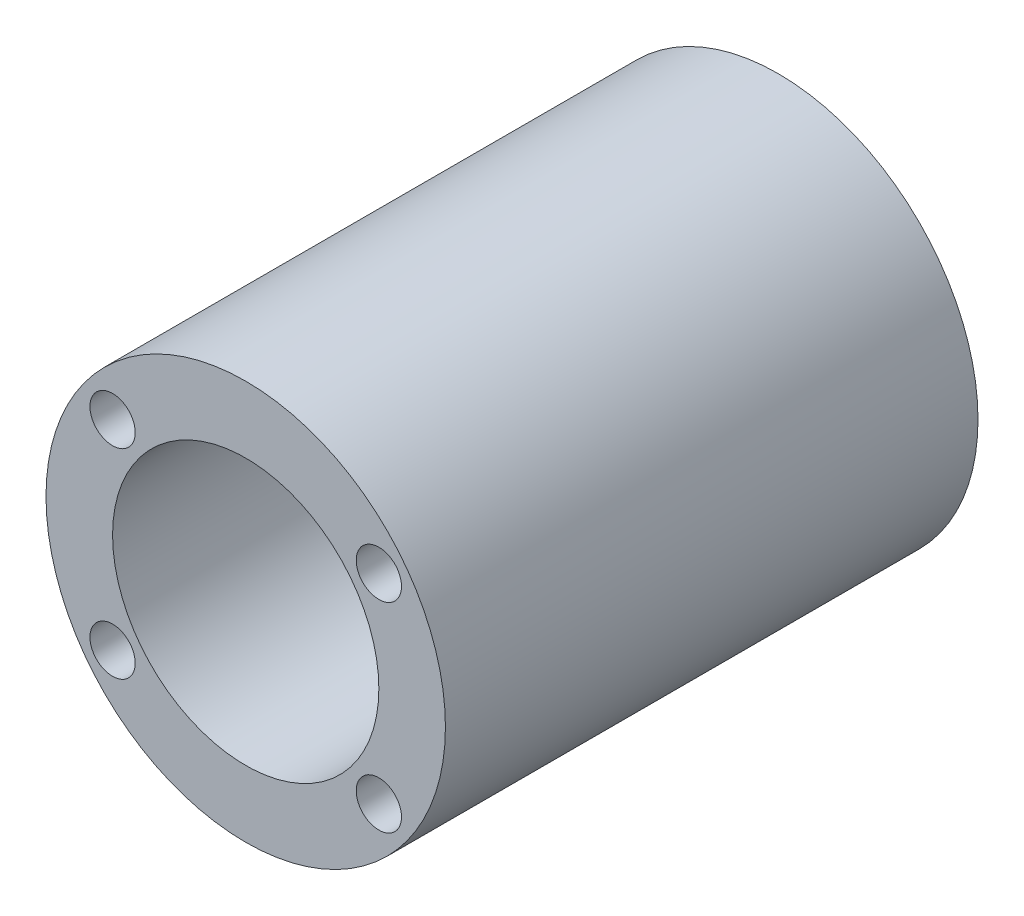
ISO-10303-21;
HEADER;
FILE_DESCRIPTION(('STEP AP214'),'2;1');
FILE_NAME('part.step','',(''),(''),'','','');
FILE_SCHEMA(('AUTOMOTIVE_DESIGN { 1 0 10303 214 1 1 1 1 }'));
ENDSEC;
DATA;
#1=APPLICATION_CONTEXT('core data for automotive mechanical design processes');
#2=APPLICATION_PROTOCOL_DEFINITION('international standard','automotive_design',2000,#1);
#3=PRODUCT_CONTEXT('',#1,'mechanical');
#4=PRODUCT('Part','Part','',(#3));
#5=PRODUCT_RELATED_PRODUCT_CATEGORY('part','',(#4));
#6=PRODUCT_DEFINITION_FORMATION('','',#4);
#7=PRODUCT_DEFINITION_CONTEXT('part definition',#1,'design');
#8=PRODUCT_DEFINITION('design','',#6,#7);
#9=PRODUCT_DEFINITION_SHAPE('','',#8);
#10=(LENGTH_UNIT() NAMED_UNIT(*) SI_UNIT(.MILLI.,.METRE.));
#11=(NAMED_UNIT(*) PLANE_ANGLE_UNIT() SI_UNIT($,.RADIAN.));
#12=(NAMED_UNIT(*) SI_UNIT($,.STERADIAN.) SOLID_ANGLE_UNIT());
#13=UNCERTAINTY_MEASURE_WITH_UNIT(LENGTH_MEASURE(1.E-05),#10,'distance_accuracy_value','');
#14=(GEOMETRIC_REPRESENTATION_CONTEXT(3) GLOBAL_UNCERTAINTY_ASSIGNED_CONTEXT((#13)) GLOBAL_UNIT_ASSIGNED_CONTEXT((#10,
#11,#12)) REPRESENTATION_CONTEXT('',''));
#15=CARTESIAN_POINT('',(0.,0.,0.));
#16=DIRECTION('',(0.,0.,1.));
#17=DIRECTION('',(1.,0.,0.));
#18=AXIS2_PLACEMENT_3D('',#15,#16,#17);
#19=CARTESIAN_POINT('',(0.,0.,40.));
#20=DIRECTION('',(0.,0.,1.));
#21=DIRECTION('',(1.,0.,0.));
#22=AXIS2_PLACEMENT_3D('',#19,#20,#21);
#23=PLANE('',#22);
#24=CARTESIAN_POINT('',(-20.,15.,40.));
#25=DIRECTION('',(0.,0.,1.));
#26=DIRECTION('',(1.,0.,0.));
#27=AXIS2_PLACEMENT_3D('',#24,#25,#26);
#28=CIRCLE('',#27,3.4);
#29=CARTESIAN_POINT('',(-16.6,15.,40.));
#30=VERTEX_POINT('',#29);
#31=EDGE_CURVE('E114',#30,#30,#28,.T.);
#32=ORIENTED_EDGE('',*,*,#31,.F.);
#33=EDGE_LOOP('',(#32));
#34=FACE_BOUND('',#33,.T.);
#35=CARTESIAN_POINT('',(20.,15.,40.));
#36=DIRECTION('',(0.,0.,1.));
#37=DIRECTION('',(1.,0.,0.));
#38=AXIS2_PLACEMENT_3D('',#35,#36,#37);
#39=CIRCLE('',#38,3.4);
#40=CARTESIAN_POINT('',(23.4,15.,40.));
#41=VERTEX_POINT('',#40);
#42=EDGE_CURVE('E122',#41,#41,#39,.T.);
#43=ORIENTED_EDGE('',*,*,#42,.F.);
#44=EDGE_LOOP('',(#43));
#45=FACE_BOUND('',#44,.T.);
#46=CARTESIAN_POINT('',(20.,-15.,40.));
#47=DIRECTION('',(0.,0.,1.));
#48=DIRECTION('',(1.,0.,0.));
#49=AXIS2_PLACEMENT_3D('',#46,#47,#48);
#50=CIRCLE('',#49,3.4);
#51=CARTESIAN_POINT('',(23.4,-15.,40.));
#52=VERTEX_POINT('',#51);
#53=EDGE_CURVE('E130',#52,#52,#50,.T.);
#54=ORIENTED_EDGE('',*,*,#53,.F.);
#55=EDGE_LOOP('',(#54));
#56=FACE_BOUND('',#55,.T.);
#57=CARTESIAN_POINT('',(-20.,-15.,40.));
#58=DIRECTION('',(0.,0.,1.));
#59=DIRECTION('',(1.,0.,0.));
#60=AXIS2_PLACEMENT_3D('',#57,#58,#59);
#61=CIRCLE('',#60,3.4);
#62=CARTESIAN_POINT('',(-16.6,-15.,40.));
#63=VERTEX_POINT('',#62);
#64=EDGE_CURVE('E138',#63,#63,#61,.T.);
#65=ORIENTED_EDGE('',*,*,#64,.F.);
#66=EDGE_LOOP('',(#65));
#67=FACE_BOUND('',#66,.T.);
#68=CARTESIAN_POINT('',(0.,0.,40.));
#69=DIRECTION('',(0.,0.,1.));
#70=DIRECTION('',(1.,0.,0.));
#71=AXIS2_PLACEMENT_3D('',#68,#69,#70);
#72=CIRCLE('',#71,30.);
#73=CARTESIAN_POINT('',(30.,0.,40.));
#74=VERTEX_POINT('',#73);
#75=EDGE_CURVE('E11',#74,#74,#72,.T.);
#76=ORIENTED_EDGE('',*,*,#75,.T.);
#77=EDGE_LOOP('',(#76));
#78=FACE_BOUND('',#77,.T.);
#79=CARTESIAN_POINT('',(0.,0.,40.));
#80=DIRECTION('',(0.,0.,1.));
#81=DIRECTION('',(1.,0.,0.));
#82=AXIS2_PLACEMENT_3D('',#79,#80,#81);
#83=CIRCLE('',#82,20.);
#84=CARTESIAN_POINT('',(20.,0.,40.));
#85=VERTEX_POINT('',#84);
#86=EDGE_CURVE('E147',#85,#85,#83,.T.);
#87=ORIENTED_EDGE('',*,*,#86,.F.);
#88=EDGE_LOOP('',(#87));
#89=FACE_BOUND('',#88,.T.);
#90=ADVANCED_FACE('F39',(#34,#45,#56,#67,#78,#89),#23,.T.);
#91=CARTESIAN_POINT('',(0.,0.,-40.));
#92=DIRECTION('',(0.,0.,1.));
#93=DIRECTION('',(1.,0.,0.));
#94=AXIS2_PLACEMENT_3D('',#91,#92,#93);
#95=PLANE('',#94);
#96=CARTESIAN_POINT('',(-20.,15.,-40.));
#97=DIRECTION('',(0.,0.,-1.));
#98=DIRECTION('',(-1.,0.,0.));
#99=AXIS2_PLACEMENT_3D('',#96,#97,#98);
#100=CIRCLE('',#99,3.4);
#101=CARTESIAN_POINT('',(-23.4,15.,-40.));
#102=VERTEX_POINT('',#101);
#103=EDGE_CURVE('E85',#102,#102,#100,.T.);
#104=ORIENTED_EDGE('',*,*,#103,.F.);
#105=EDGE_LOOP('',(#104));
#106=FACE_BOUND('',#105,.T.);
#107=CARTESIAN_POINT('',(20.,15.,-40.));
#108=DIRECTION('',(0.,0.,-1.));
#109=DIRECTION('',(-1.,0.,0.));
#110=AXIS2_PLACEMENT_3D('',#107,#108,#109);
#111=CIRCLE('',#110,3.4);
#112=CARTESIAN_POINT('',(16.6,15.,-40.));
#113=VERTEX_POINT('',#112);
#114=EDGE_CURVE('E84',#113,#113,#111,.T.);
#115=ORIENTED_EDGE('',*,*,#114,.F.);
#116=EDGE_LOOP('',(#115));
#117=FACE_BOUND('',#116,.T.);
#118=CARTESIAN_POINT('',(20.,-15.,-40.));
#119=DIRECTION('',(0.,0.,-1.));
#120=DIRECTION('',(-1.,0.,0.));
#121=AXIS2_PLACEMENT_3D('',#118,#119,#120);
#122=CIRCLE('',#121,3.4);
#123=CARTESIAN_POINT('',(16.6,-15.,-40.));
#124=VERTEX_POINT('',#123);
#125=EDGE_CURVE('E98',#124,#124,#122,.T.);
#126=ORIENTED_EDGE('',*,*,#125,.F.);
#127=EDGE_LOOP('',(#126));
#128=FACE_BOUND('',#127,.T.);
#129=CARTESIAN_POINT('',(-20.,-15.,-40.));
#130=DIRECTION('',(0.,0.,-1.));
#131=DIRECTION('',(-1.,0.,0.));
#132=AXIS2_PLACEMENT_3D('',#129,#130,#131);
#133=CIRCLE('',#132,3.4);
#134=CARTESIAN_POINT('',(-23.4,-15.,-40.));
#135=VERTEX_POINT('',#134);
#136=EDGE_CURVE('E106',#135,#135,#133,.T.);
#137=ORIENTED_EDGE('',*,*,#136,.F.);
#138=EDGE_LOOP('',(#137));
#139=FACE_BOUND('',#138,.T.);
#140=CARTESIAN_POINT('',(0.,0.,-40.));
#141=DIRECTION('',(0.,0.,1.));
#142=DIRECTION('',(1.,0.,0.));
#143=AXIS2_PLACEMENT_3D('',#140,#141,#142);
#144=CIRCLE('',#143,30.);
#145=CARTESIAN_POINT('',(30.,0.,-40.));
#146=VERTEX_POINT('',#145);
#147=EDGE_CURVE('E43',#146,#146,#144,.T.);
#148=ORIENTED_EDGE('',*,*,#147,.F.);
#149=EDGE_LOOP('',(#148));
#150=FACE_BOUND('',#149,.T.);
#151=CARTESIAN_POINT('',(0.,0.,-40.));
#152=DIRECTION('',(0.,0.,1.));
#153=DIRECTION('',(1.,0.,0.));
#154=AXIS2_PLACEMENT_3D('',#151,#152,#153);
#155=CIRCLE('',#154,20.);
#156=CARTESIAN_POINT('',(20.,0.,-40.));
#157=VERTEX_POINT('',#156);
#158=EDGE_CURVE('E146',#157,#157,#155,.T.);
#159=ORIENTED_EDGE('',*,*,#158,.T.);
#160=EDGE_LOOP('',(#159));
#161=FACE_BOUND('',#160,.T.);
#162=ADVANCED_FACE('F155',(#106,#117,#128,#139,#150,#161),#95,.F.);
#163=CARTESIAN_POINT('',(0.,0.,40.));
#164=DIRECTION('',(0.,0.,-1.));
#165=DIRECTION('',(-1.,0.,0.));
#166=AXIS2_PLACEMENT_3D('',#163,#164,#165);
#167=CYLINDRICAL_SURFACE('',#166,30.);
#168=ORIENTED_EDGE('',*,*,#75,.F.);
#169=EDGE_LOOP('',(#168));
#170=FACE_BOUND('',#169,.T.);
#171=ORIENTED_EDGE('',*,*,#147,.T.);
#172=EDGE_LOOP('',(#171));
#173=FACE_BOUND('',#172,.T.);
#174=ADVANCED_FACE('F41',(#170,#173),#167,.T.);
#175=CARTESIAN_POINT('',(0.,0.,40.));
#176=DIRECTION('',(0.,0.,-1.));
#177=DIRECTION('',(-1.,0.,0.));
#178=AXIS2_PLACEMENT_3D('',#175,#176,#177);
#179=CYLINDRICAL_SURFACE('',#178,20.);
#180=ORIENTED_EDGE('',*,*,#86,.T.);
#181=EDGE_LOOP('',(#180));
#182=FACE_BOUND('',#181,.T.);
#183=ORIENTED_EDGE('',*,*,#158,.F.);
#184=EDGE_LOOP('',(#183));
#185=FACE_BOUND('',#184,.T.);
#186=ADVANCED_FACE('F157',(#182,#185),#179,.F.);
#187=CARTESIAN_POINT('',(-20.,-15.,20.));
#188=DIRECTION('',(0.,0.,1.));
#189=DIRECTION('',(1.,0.,0.));
#190=AXIS2_PLACEMENT_3D('',#187,#188,#189);
#191=CONICAL_SURFACE('',#190,3.39999999999999,1.02974425867665);
#192=CARTESIAN_POINT('',(-20.,-15.,17.9570738953063));
#193=VERTEX_POINT('',#192);
#194=VERTEX_LOOP('',#193);
#195=FACE_BOUND('',#194,.T.);
#196=CARTESIAN_POINT('',(-20.,-15.,20.));
#197=DIRECTION('',(0.,0.,1.));
#198=DIRECTION('',(1.,0.,0.));
#199=AXIS2_PLACEMENT_3D('',#196,#197,#198);
#200=CIRCLE('',#199,3.39999999999999);
#201=CARTESIAN_POINT('',(-16.6,-15.,20.));
#202=VERTEX_POINT('',#201);
#203=EDGE_CURVE('E142',#202,#202,#200,.T.);
#204=ORIENTED_EDGE('',*,*,#203,.T.);
#205=EDGE_LOOP('',(#204));
#206=FACE_BOUND('',#205,.T.);
#207=ADVANCED_FACE('F159',(#195,#206),#191,.F.);
#208=CARTESIAN_POINT('',(-20.,-15.,40.));
#209=DIRECTION('',(0.,0.,1.));
#210=DIRECTION('',(1.,0.,0.));
#211=AXIS2_PLACEMENT_3D('',#208,#209,#210);
#212=CYLINDRICAL_SURFACE('',#211,3.4);
#213=ORIENTED_EDGE('',*,*,#203,.F.);
#214=EDGE_LOOP('',(#213));
#215=FACE_BOUND('',#214,.T.);
#216=ORIENTED_EDGE('',*,*,#64,.T.);
#217=EDGE_LOOP('',(#216));
#218=FACE_BOUND('',#217,.T.);
#219=ADVANCED_FACE('F166',(#215,#218),#212,.F.);
#220=CARTESIAN_POINT('',(20.,-15.,20.));
#221=DIRECTION('',(0.,0.,1.));
#222=DIRECTION('',(1.,0.,0.));
#223=AXIS2_PLACEMENT_3D('',#220,#221,#222);
#224=CONICAL_SURFACE('',#223,3.39999999999999,1.02974425867665);
#225=CARTESIAN_POINT('',(20.,-15.,17.9570738953063));
#226=VERTEX_POINT('',#225);
#227=VERTEX_LOOP('',#226);
#228=FACE_BOUND('',#227,.T.);
#229=CARTESIAN_POINT('',(20.,-15.,20.));
#230=DIRECTION('',(0.,0.,1.));
#231=DIRECTION('',(1.,0.,0.));
#232=AXIS2_PLACEMENT_3D('',#229,#230,#231);
#233=CIRCLE('',#232,3.39999999999999);
#234=CARTESIAN_POINT('',(23.4,-15.,20.));
#235=VERTEX_POINT('',#234);
#236=EDGE_CURVE('E134',#235,#235,#233,.T.);
#237=ORIENTED_EDGE('',*,*,#236,.T.);
#238=EDGE_LOOP('',(#237));
#239=FACE_BOUND('',#238,.T.);
#240=ADVANCED_FACE('F194',(#228,#239),#224,.F.);
#241=CARTESIAN_POINT('',(20.,-15.,40.));
#242=DIRECTION('',(0.,0.,1.));
#243=DIRECTION('',(1.,0.,0.));
#244=AXIS2_PLACEMENT_3D('',#241,#242,#243);
#245=CYLINDRICAL_SURFACE('',#244,3.4);
#246=ORIENTED_EDGE('',*,*,#236,.F.);
#247=EDGE_LOOP('',(#246));
#248=FACE_BOUND('',#247,.T.);
#249=ORIENTED_EDGE('',*,*,#53,.T.);
#250=EDGE_LOOP('',(#249));
#251=FACE_BOUND('',#250,.T.);
#252=ADVANCED_FACE('F200',(#248,#251),#245,.F.);
#253=CARTESIAN_POINT('',(20.,15.,20.));
#254=DIRECTION('',(0.,0.,1.));
#255=DIRECTION('',(1.,0.,0.));
#256=AXIS2_PLACEMENT_3D('',#253,#254,#255);
#257=CONICAL_SURFACE('',#256,3.39999999999999,1.02974425867665);
#258=CARTESIAN_POINT('',(20.,15.,17.9570738953063));
#259=VERTEX_POINT('',#258);
#260=VERTEX_LOOP('',#259);
#261=FACE_BOUND('',#260,.T.);
#262=CARTESIAN_POINT('',(20.,15.,20.));
#263=DIRECTION('',(0.,0.,1.));
#264=DIRECTION('',(1.,0.,0.));
#265=AXIS2_PLACEMENT_3D('',#262,#263,#264);
#266=CIRCLE('',#265,3.39999999999999);
#267=CARTESIAN_POINT('',(23.4,15.,20.));
#268=VERTEX_POINT('',#267);
#269=EDGE_CURVE('E126',#268,#268,#266,.T.);
#270=ORIENTED_EDGE('',*,*,#269,.T.);
#271=EDGE_LOOP('',(#270));
#272=FACE_BOUND('',#271,.T.);
#273=ADVANCED_FACE('F206',(#261,#272),#257,.F.);
#274=CARTESIAN_POINT('',(20.,15.,40.));
#275=DIRECTION('',(0.,0.,1.));
#276=DIRECTION('',(1.,0.,0.));
#277=AXIS2_PLACEMENT_3D('',#274,#275,#276);
#278=CYLINDRICAL_SURFACE('',#277,3.4);
#279=ORIENTED_EDGE('',*,*,#269,.F.);
#280=EDGE_LOOP('',(#279));
#281=FACE_BOUND('',#280,.T.);
#282=ORIENTED_EDGE('',*,*,#42,.T.);
#283=EDGE_LOOP('',(#282));
#284=FACE_BOUND('',#283,.T.);
#285=ADVANCED_FACE('F210',(#281,#284),#278,.F.);
#286=CARTESIAN_POINT('',(-20.,15.,20.));
#287=DIRECTION('',(0.,0.,1.));
#288=DIRECTION('',(1.,0.,0.));
#289=AXIS2_PLACEMENT_3D('',#286,#287,#288);
#290=CONICAL_SURFACE('',#289,3.39999999999999,1.02974425867665);
#291=CARTESIAN_POINT('',(-20.,15.,17.9570738953063));
#292=VERTEX_POINT('',#291);
#293=VERTEX_LOOP('',#292);
#294=FACE_BOUND('',#293,.T.);
#295=CARTESIAN_POINT('',(-20.,15.,20.));
#296=DIRECTION('',(0.,0.,1.));
#297=DIRECTION('',(1.,0.,0.));
#298=AXIS2_PLACEMENT_3D('',#295,#296,#297);
#299=CIRCLE('',#298,3.39999999999999);
#300=CARTESIAN_POINT('',(-16.6,15.,20.));
#301=VERTEX_POINT('',#300);
#302=EDGE_CURVE('E118',#301,#301,#299,.T.);
#303=ORIENTED_EDGE('',*,*,#302,.T.);
#304=EDGE_LOOP('',(#303));
#305=FACE_BOUND('',#304,.T.);
#306=ADVANCED_FACE('F214',(#294,#305),#290,.F.);
#307=CARTESIAN_POINT('',(-20.,15.,40.));
#308=DIRECTION('',(0.,0.,1.));
#309=DIRECTION('',(1.,0.,0.));
#310=AXIS2_PLACEMENT_3D('',#307,#308,#309);
#311=CYLINDRICAL_SURFACE('',#310,3.4);
#312=ORIENTED_EDGE('',*,*,#302,.F.);
#313=EDGE_LOOP('',(#312));
#314=FACE_BOUND('',#313,.T.);
#315=ORIENTED_EDGE('',*,*,#31,.T.);
#316=EDGE_LOOP('',(#315));
#317=FACE_BOUND('',#316,.T.);
#318=ADVANCED_FACE('F218',(#314,#317),#311,.F.);
#319=CARTESIAN_POINT('',(-20.,-15.,-20.));
#320=DIRECTION('',(0.,0.,-1.));
#321=DIRECTION('',(-1.,0.,0.));
#322=AXIS2_PLACEMENT_3D('',#319,#320,#321);
#323=CONICAL_SURFACE('',#322,3.39999999999999,1.02974425867665);
#324=CARTESIAN_POINT('',(-20.,-15.,-17.9570738953063));
#325=VERTEX_POINT('',#324);
#326=VERTEX_LOOP('',#325);
#327=FACE_BOUND('',#326,.T.);
#328=CARTESIAN_POINT('',(-20.,-15.,-20.));
#329=DIRECTION('',(0.,0.,-1.));
#330=DIRECTION('',(-1.,0.,0.));
#331=AXIS2_PLACEMENT_3D('',#328,#329,#330);
#332=CIRCLE('',#331,3.39999999999999);
#333=CARTESIAN_POINT('',(-23.4,-15.,-20.));
#334=VERTEX_POINT('',#333);
#335=EDGE_CURVE('E110',#334,#334,#332,.T.);
#336=ORIENTED_EDGE('',*,*,#335,.T.);
#337=EDGE_LOOP('',(#336));
#338=FACE_BOUND('',#337,.T.);
#339=ADVANCED_FACE('F222',(#327,#338),#323,.F.);
#340=CARTESIAN_POINT('',(-20.,-15.,-40.));
#341=DIRECTION('',(0.,0.,-1.));
#342=DIRECTION('',(-1.,0.,0.));
#343=AXIS2_PLACEMENT_3D('',#340,#341,#342);
#344=CYLINDRICAL_SURFACE('',#343,3.4);
#345=ORIENTED_EDGE('',*,*,#335,.F.);
#346=EDGE_LOOP('',(#345));
#347=FACE_BOUND('',#346,.T.);
#348=ORIENTED_EDGE('',*,*,#136,.T.);
#349=EDGE_LOOP('',(#348));
#350=FACE_BOUND('',#349,.T.);
#351=ADVANCED_FACE('F226',(#347,#350),#344,.F.);
#352=CARTESIAN_POINT('',(20.,-15.,-20.));
#353=DIRECTION('',(0.,0.,-1.));
#354=DIRECTION('',(-1.,0.,0.));
#355=AXIS2_PLACEMENT_3D('',#352,#353,#354);
#356=CONICAL_SURFACE('',#355,3.39999999999999,1.02974425867665);
#357=CARTESIAN_POINT('',(20.,-15.,-17.9570738953063));
#358=VERTEX_POINT('',#357);
#359=VERTEX_LOOP('',#358);
#360=FACE_BOUND('',#359,.T.);
#361=CARTESIAN_POINT('',(20.,-15.,-20.));
#362=DIRECTION('',(0.,0.,-1.));
#363=DIRECTION('',(-1.,0.,0.));
#364=AXIS2_PLACEMENT_3D('',#361,#362,#363);
#365=CIRCLE('',#364,3.39999999999999);
#366=CARTESIAN_POINT('',(16.6,-15.,-20.));
#367=VERTEX_POINT('',#366);
#368=EDGE_CURVE('E102',#367,#367,#365,.T.);
#369=ORIENTED_EDGE('',*,*,#368,.T.);
#370=EDGE_LOOP('',(#369));
#371=FACE_BOUND('',#370,.T.);
#372=ADVANCED_FACE('F230',(#360,#371),#356,.F.);
#373=CARTESIAN_POINT('',(20.,-15.,-40.));
#374=DIRECTION('',(0.,0.,-1.));
#375=DIRECTION('',(-1.,0.,0.));
#376=AXIS2_PLACEMENT_3D('',#373,#374,#375);
#377=CYLINDRICAL_SURFACE('',#376,3.4);
#378=ORIENTED_EDGE('',*,*,#368,.F.);
#379=EDGE_LOOP('',(#378));
#380=FACE_BOUND('',#379,.T.);
#381=ORIENTED_EDGE('',*,*,#125,.T.);
#382=EDGE_LOOP('',(#381));
#383=FACE_BOUND('',#382,.T.);
#384=ADVANCED_FACE('F234',(#380,#383),#377,.F.);
#385=CARTESIAN_POINT('',(20.,15.,-20.));
#386=DIRECTION('',(0.,0.,-1.));
#387=DIRECTION('',(-1.,0.,0.));
#388=AXIS2_PLACEMENT_3D('',#385,#386,#387);
#389=CONICAL_SURFACE('',#388,3.39999999999999,1.02974425867665);
#390=CARTESIAN_POINT('',(20.,15.,-17.9570738953063));
#391=VERTEX_POINT('',#390);
#392=VERTEX_LOOP('',#391);
#393=FACE_BOUND('',#392,.T.);
#394=CARTESIAN_POINT('',(20.,15.,-20.));
#395=DIRECTION('',(0.,0.,-1.));
#396=DIRECTION('',(-1.,0.,0.));
#397=AXIS2_PLACEMENT_3D('',#394,#395,#396);
#398=CIRCLE('',#397,3.39999999999999);
#399=CARTESIAN_POINT('',(16.6,15.,-20.));
#400=VERTEX_POINT('',#399);
#401=EDGE_CURVE('E90',#400,#400,#398,.T.);
#402=ORIENTED_EDGE('',*,*,#401,.T.);
#403=EDGE_LOOP('',(#402));
#404=FACE_BOUND('',#403,.T.);
#405=ADVANCED_FACE('F238',(#393,#404),#389,.F.);
#406=CARTESIAN_POINT('',(20.,15.,-40.));
#407=DIRECTION('',(0.,0.,-1.));
#408=DIRECTION('',(-1.,0.,0.));
#409=AXIS2_PLACEMENT_3D('',#406,#407,#408);
#410=CYLINDRICAL_SURFACE('',#409,3.4);
#411=ORIENTED_EDGE('',*,*,#401,.F.);
#412=EDGE_LOOP('',(#411));
#413=FACE_BOUND('',#412,.T.);
#414=ORIENTED_EDGE('',*,*,#114,.T.);
#415=EDGE_LOOP('',(#414));
#416=FACE_BOUND('',#415,.T.);
#417=ADVANCED_FACE('F77',(#413,#416),#410,.F.);
#418=CARTESIAN_POINT('',(-20.,15.,-20.));
#419=DIRECTION('',(0.,0.,-1.));
#420=DIRECTION('',(-1.,0.,0.));
#421=AXIS2_PLACEMENT_3D('',#418,#419,#420);
#422=CONICAL_SURFACE('',#421,3.39999999999999,1.02974425867665);
#423=CARTESIAN_POINT('',(-20.,15.,-17.9570738953063));
#424=VERTEX_POINT('',#423);
#425=VERTEX_LOOP('',#424);
#426=FACE_BOUND('',#425,.T.);
#427=CARTESIAN_POINT('',(-20.,15.,-20.));
#428=DIRECTION('',(0.,0.,-1.));
#429=DIRECTION('',(-1.,0.,0.));
#430=AXIS2_PLACEMENT_3D('',#427,#428,#429);
#431=CIRCLE('',#430,3.39999999999999);
#432=CARTESIAN_POINT('',(-23.4,15.,-20.));
#433=VERTEX_POINT('',#432);
#434=EDGE_CURVE('E81',#433,#433,#431,.T.);
#435=ORIENTED_EDGE('',*,*,#434,.T.);
#436=EDGE_LOOP('',(#435));
#437=FACE_BOUND('',#436,.T.);
#438=ADVANCED_FACE('F73',(#426,#437),#422,.F.);
#439=CARTESIAN_POINT('',(-20.,15.,-40.));
#440=DIRECTION('',(0.,0.,-1.));
#441=DIRECTION('',(-1.,0.,0.));
#442=AXIS2_PLACEMENT_3D('',#439,#440,#441);
#443=CYLINDRICAL_SURFACE('',#442,3.4);
#444=ORIENTED_EDGE('',*,*,#434,.F.);
#445=EDGE_LOOP('',(#444));
#446=FACE_BOUND('',#445,.T.);
#447=ORIENTED_EDGE('',*,*,#103,.T.);
#448=EDGE_LOOP('',(#447));
#449=FACE_BOUND('',#448,.T.);
#450=ADVANCED_FACE('F76',(#446,#449),#443,.F.);
#451=CLOSED_SHELL('',(#90,#162,#174,#186,#207,#219,#240,#252,#273,#285,#306,#318,#339,#351,#372,
#384,#405,#417,#438,#450));
#452=MANIFOLD_SOLID_BREP('B2',#451);
#453=ADVANCED_BREP_SHAPE_REPRESENTATION('',(#18,#452),#14);
#454=SHAPE_DEFINITION_REPRESENTATION(#9,#453);
ENDSEC;
END-ISO-10303-21;
